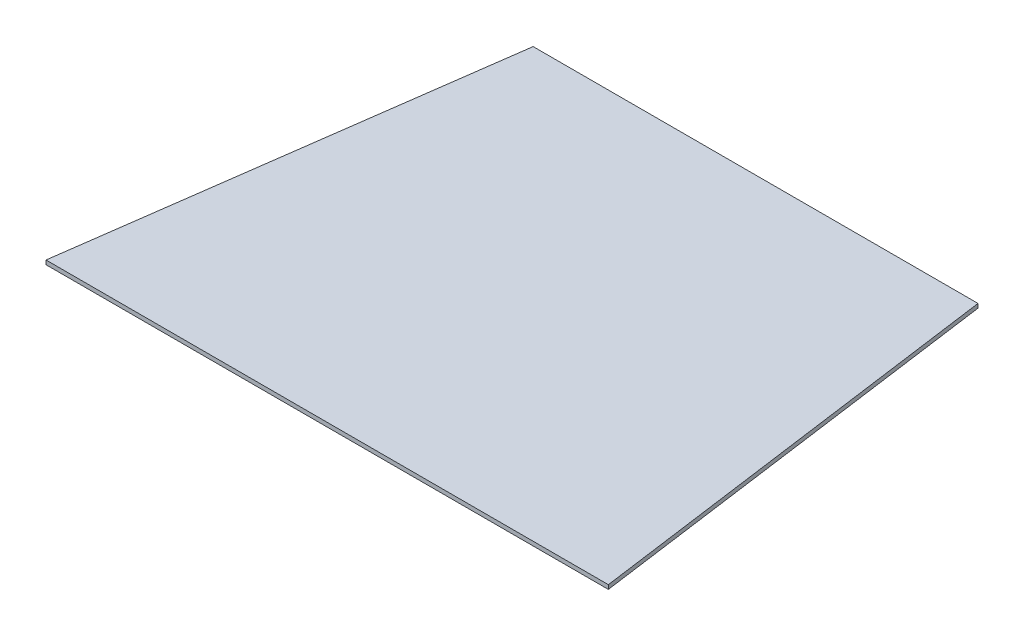
ISO-10303-21;
HEADER;
FILE_DESCRIPTION(('STEP AP214'),'2;1');
FILE_NAME('part.step','',(''),(''),'','','');
FILE_SCHEMA(('AUTOMOTIVE_DESIGN { 1 0 10303 214 1 1 1 1 }'));
ENDSEC;
DATA;
#1=APPLICATION_CONTEXT('core data for automotive mechanical design processes');
#2=APPLICATION_PROTOCOL_DEFINITION('international standard','automotive_design',2000,#1);
#3=PRODUCT_CONTEXT('',#1,'mechanical');
#4=PRODUCT('Part','Part','',(#3));
#5=PRODUCT_RELATED_PRODUCT_CATEGORY('part','',(#4));
#6=PRODUCT_DEFINITION_FORMATION('','',#4);
#7=PRODUCT_DEFINITION_CONTEXT('part definition',#1,'design');
#8=PRODUCT_DEFINITION('design','',#6,#7);
#9=PRODUCT_DEFINITION_SHAPE('','',#8);
#10=(LENGTH_UNIT() NAMED_UNIT(*) SI_UNIT(.MILLI.,.METRE.));
#11=(NAMED_UNIT(*) PLANE_ANGLE_UNIT() SI_UNIT($,.RADIAN.));
#12=(NAMED_UNIT(*) SI_UNIT($,.STERADIAN.) SOLID_ANGLE_UNIT());
#13=UNCERTAINTY_MEASURE_WITH_UNIT(LENGTH_MEASURE(1.E-05),#10,'distance_accuracy_value','');
#14=(GEOMETRIC_REPRESENTATION_CONTEXT(3) GLOBAL_UNCERTAINTY_ASSIGNED_CONTEXT((#13)) GLOBAL_UNIT_ASSIGNED_CONTEXT((#10,
#11,#12)) REPRESENTATION_CONTEXT('',''));
#15=CARTESIAN_POINT('',(0.,0.,0.));
#16=DIRECTION('',(0.,0.,1.));
#17=DIRECTION('',(1.,0.,0.));
#18=AXIS2_PLACEMENT_3D('',#15,#16,#17);
#19=CARTESIAN_POINT('',(-118.406015037594,1.5875,72.2531328320802));
#20=DIRECTION('',(0.,0.,-1.));
#21=DIRECTION('',(-1.,0.,0.));
#22=AXIS2_PLACEMENT_3D('',#19,#20,#21);
#23=PLANE('',#22);
#24=DIRECTION('',(1.,0.,0.));
#25=VECTOR('',#24,1.);
#26=CARTESIAN_POINT('',(-118.406015037594,1.5875,72.2531328320802));
#27=LINE('',#26,#25);
#28=CARTESIAN_POINT('',(-99.7745481909078,1.5875,72.2531328320802));
#29=VERTEX_POINT('',#28);
#30=CARTESIAN_POINT('',(116.962518034406,1.5875,72.2531328320802));
#31=VERTEX_POINT('',#30);
#32=EDGE_CURVE('E47',#29,#31,#27,.T.);
#33=ORIENTED_EDGE('',*,*,#32,.F.);
#34=DIRECTION('',(0.,1.,0.));
#35=VECTOR('',#34,1.);
#36=CARTESIAN_POINT('',(-99.7745481909078,0.,72.2531328320802));
#37=LINE('',#36,#35);
#38=CARTESIAN_POINT('',(-99.7745481909078,0.,72.2531328320802));
#39=VERTEX_POINT('',#38);
#40=EDGE_CURVE('E79',#39,#29,#37,.T.);
#41=ORIENTED_EDGE('',*,*,#40,.F.);
#42=DIRECTION('',(1.,0.,0.));
#43=VECTOR('',#42,1.);
#44=CARTESIAN_POINT('',(-118.406015037594,0.,72.2531328320802));
#45=LINE('',#44,#43);
#46=CARTESIAN_POINT('',(116.962518034406,0.,72.2531328320802));
#47=VERTEX_POINT('',#46);
#48=EDGE_CURVE('E97',#39,#47,#45,.T.);
#49=ORIENTED_EDGE('',*,*,#48,.T.);
#50=DIRECTION('',(0.,1.,0.));
#51=VECTOR('',#50,1.);
#52=CARTESIAN_POINT('',(116.962518034406,0.,72.2531328320802));
#53=LINE('',#52,#51);
#54=EDGE_CURVE('E55',#47,#31,#53,.T.);
#55=ORIENTED_EDGE('',*,*,#54,.T.);
#56=EDGE_LOOP('',(#33,#41,#49,#55));
#57=FACE_BOUND('',#56,.T.);
#58=ADVANCED_FACE('F39',(#57),#23,.F.);
#59=CARTESIAN_POINT('',(-118.406015037594,1.5875,-92.8468671679198));
#60=DIRECTION('',(0.,0.,1.));
#61=DIRECTION('',(1.,0.,0.));
#62=AXIS2_PLACEMENT_3D('',#59,#60,#61);
#63=PLANE('',#62);
#64=DIRECTION('',(-1.,0.,0.));
#65=VECTOR('',#64,1.);
#66=CARTESIAN_POINT('',(-118.406015037594,0.,-92.8468671679198));
#67=LINE('',#66,#65);
#68=CARTESIAN_POINT('',(94.318984962406,0.,-92.8468671679198));
#69=VERTEX_POINT('',#68);
#70=CARTESIAN_POINT('',(-77.131015037594,0.,-92.8468671679198));
#71=VERTEX_POINT('',#70);
#72=EDGE_CURVE('E42',#69,#71,#67,.T.);
#73=ORIENTED_EDGE('',*,*,#72,.T.);
#74=DIRECTION('',(0.,1.,0.));
#75=VECTOR('',#74,1.);
#76=CARTESIAN_POINT('',(-77.131015037594,0.,-92.8468671679198));
#77=LINE('',#76,#75);
#78=CARTESIAN_POINT('',(-77.131015037594,1.5875,-92.8468671679198));
#79=VERTEX_POINT('',#78);
#80=EDGE_CURVE('E63',#71,#79,#77,.T.);
#81=ORIENTED_EDGE('',*,*,#80,.T.);
#82=DIRECTION('',(-1.,0.,0.));
#83=VECTOR('',#82,1.);
#84=CARTESIAN_POINT('',(-118.406015037594,1.5875,-92.8468671679198));
#85=LINE('',#84,#83);
#86=CARTESIAN_POINT('',(94.318984962406,1.5875,-92.8468671679198));
#87=VERTEX_POINT('',#86);
#88=EDGE_CURVE('E11',#87,#79,#85,.T.);
#89=ORIENTED_EDGE('',*,*,#88,.F.);
#90=DIRECTION('',(0.,1.,0.));
#91=VECTOR('',#90,1.);
#92=CARTESIAN_POINT('',(94.318984962406,0.,-92.8468671679198));
#93=LINE('',#92,#91);
#94=EDGE_CURVE('E99',#69,#87,#93,.T.);
#95=ORIENTED_EDGE('',*,*,#94,.F.);
#96=EDGE_LOOP('',(#73,#81,#89,#95));
#97=FACE_BOUND('',#96,.T.);
#98=ADVANCED_FACE('F111',(#97),#63,.F.);
#99=CARTESIAN_POINT('',(0.,1.5875,0.));
#100=DIRECTION('',(0.,1.,0.));
#101=DIRECTION('',(0.,0.,1.));
#102=AXIS2_PLACEMENT_3D('',#99,#100,#101);
#103=PLANE('',#102);
#104=DIRECTION('',(0.135878414081738,0.,-0.990725520306523));
#105=VECTOR('',#104,1.);
#106=CARTESIAN_POINT('',(-77.131015037594,1.5875,-92.8468671679198));
#107=LINE('',#106,#105);
#108=EDGE_CURVE('E82',#29,#79,#107,.T.);
#109=ORIENTED_EDGE('',*,*,#108,.F.);
#110=ORIENTED_EDGE('',*,*,#32,.T.);
#111=DIRECTION('',(0.135878413602802,0.,0.99072552037221));
#112=VECTOR('',#111,1.);
#113=CARTESIAN_POINT('',(94.318984962406,1.5875,-92.8468671679198));
#114=LINE('',#113,#112);
#115=EDGE_CURVE('E107',#87,#31,#114,.T.);
#116=ORIENTED_EDGE('',*,*,#115,.F.);
#117=ORIENTED_EDGE('',*,*,#88,.T.);
#118=EDGE_LOOP('',(#109,#110,#116,#117));
#119=FACE_BOUND('',#118,.T.);
#120=ADVANCED_FACE('F91',(#119),#103,.T.);
#121=CARTESIAN_POINT('',(0.,0.,0.));
#122=DIRECTION('',(0.,1.,0.));
#123=DIRECTION('',(0.,0.,1.));
#124=AXIS2_PLACEMENT_3D('',#121,#122,#123);
#125=PLANE('',#124);
#126=ORIENTED_EDGE('',*,*,#48,.F.);
#127=DIRECTION('',(0.135878414081738,0.,-0.990725520306523));
#128=VECTOR('',#127,1.);
#129=CARTESIAN_POINT('',(-77.131015037594,0.,-92.8468671679198));
#130=LINE('',#129,#128);
#131=EDGE_CURVE('E83',#39,#71,#130,.T.);
#132=ORIENTED_EDGE('',*,*,#131,.T.);
#133=ORIENTED_EDGE('',*,*,#72,.F.);
#134=DIRECTION('',(0.135878413602802,0.,0.99072552037221));
#135=VECTOR('',#134,1.);
#136=CARTESIAN_POINT('',(94.318984962406,0.,-92.8468671679198));
#137=LINE('',#136,#135);
#138=EDGE_CURVE('E105',#69,#47,#137,.T.);
#139=ORIENTED_EDGE('',*,*,#138,.T.);
#140=EDGE_LOOP('',(#126,#132,#133,#139));
#141=FACE_BOUND('',#140,.T.);
#142=ADVANCED_FACE('F117',(#141),#125,.F.);
#143=CARTESIAN_POINT('',(94.318984962406,0.,-92.8468671679198));
#144=DIRECTION('',(-0.99072552037221,0.,0.135878413602802));
#145=DIRECTION('',(0.135878413602802,0.,0.99072552037221));
#146=AXIS2_PLACEMENT_3D('',#143,#144,#145);
#147=PLANE('',#146);
#148=ORIENTED_EDGE('',*,*,#115,.T.);
#149=ORIENTED_EDGE('',*,*,#54,.F.);
#150=ORIENTED_EDGE('',*,*,#138,.F.);
#151=ORIENTED_EDGE('',*,*,#94,.T.);
#152=EDGE_LOOP('',(#148,#149,#150,#151));
#153=FACE_BOUND('',#152,.T.);
#154=ADVANCED_FACE('F109',(#153),#147,.F.);
#155=CARTESIAN_POINT('',(-77.131015037594,0.,-92.8468671679198));
#156=DIRECTION('',(0.990725520306523,0.,0.135878414081738));
#157=DIRECTION('',(0.135878414081738,0.,-0.990725520306524));
#158=AXIS2_PLACEMENT_3D('',#155,#156,#157);
#159=PLANE('',#158);
#160=ORIENTED_EDGE('',*,*,#108,.T.);
#161=ORIENTED_EDGE('',*,*,#80,.F.);
#162=ORIENTED_EDGE('',*,*,#131,.F.);
#163=ORIENTED_EDGE('',*,*,#40,.T.);
#164=EDGE_LOOP('',(#160,#161,#162,#163));
#165=FACE_BOUND('',#164,.T.);
#166=ADVANCED_FACE('F81',(#165),#159,.F.);
#167=CLOSED_SHELL('',(#58,#98,#120,#142,#154,#166));
#168=MANIFOLD_SOLID_BREP('B2',#167);
#169=ADVANCED_BREP_SHAPE_REPRESENTATION('',(#18,#168),#14);
#170=SHAPE_DEFINITION_REPRESENTATION(#9,#169);
ENDSEC;
END-ISO-10303-21;
